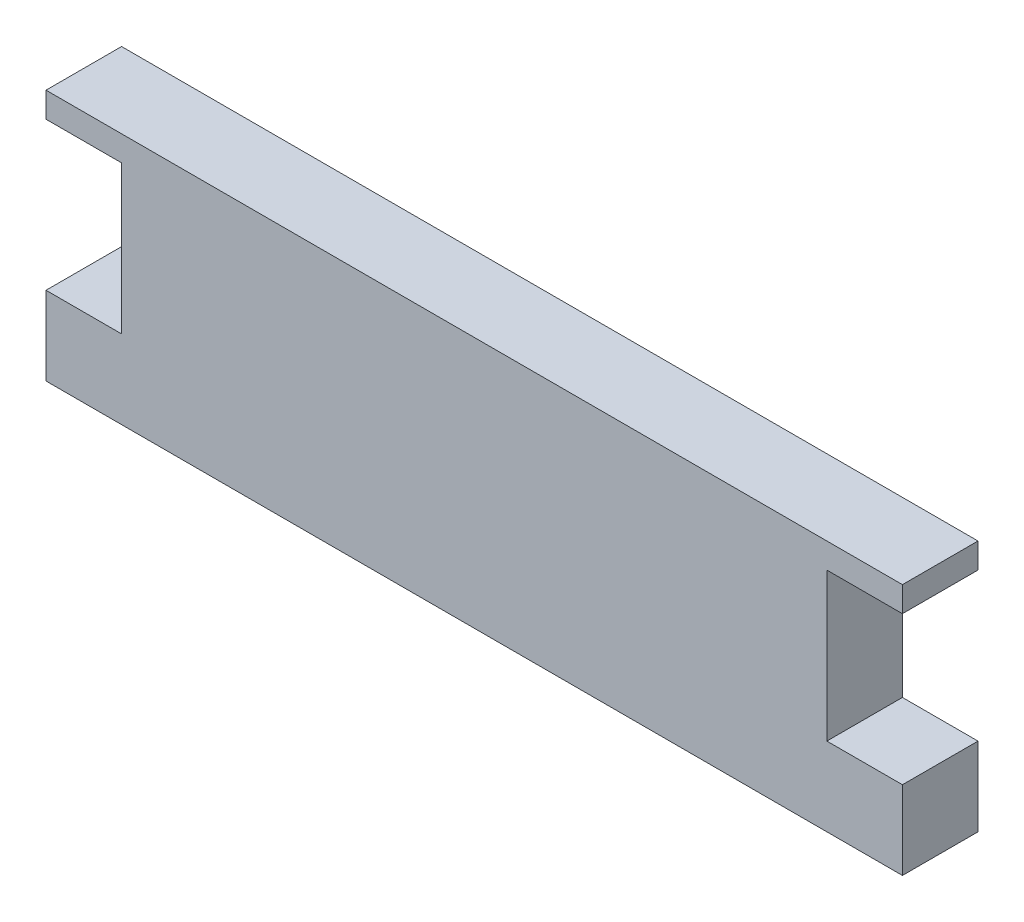
ISO-10303-21;
HEADER;
FILE_DESCRIPTION(('STEP AP214'),'2;1');
FILE_NAME('part.step','',(''),(''),'','','');
FILE_SCHEMA(('AUTOMOTIVE_DESIGN { 1 0 10303 214 1 1 1 1 }'));
ENDSEC;
DATA;
#1=APPLICATION_CONTEXT('core data for automotive mechanical design processes');
#2=APPLICATION_PROTOCOL_DEFINITION('international standard','automotive_design',2000,#1);
#3=PRODUCT_CONTEXT('',#1,'mechanical');
#4=PRODUCT('Part','Part','',(#3));
#5=PRODUCT_RELATED_PRODUCT_CATEGORY('part','',(#4));
#6=PRODUCT_DEFINITION_FORMATION('','',#4);
#7=PRODUCT_DEFINITION_CONTEXT('part definition',#1,'design');
#8=PRODUCT_DEFINITION('design','',#6,#7);
#9=PRODUCT_DEFINITION_SHAPE('','',#8);
#10=(LENGTH_UNIT() NAMED_UNIT(*) SI_UNIT(.MILLI.,.METRE.));
#11=(NAMED_UNIT(*) PLANE_ANGLE_UNIT() SI_UNIT($,.RADIAN.));
#12=(NAMED_UNIT(*) SI_UNIT($,.STERADIAN.) SOLID_ANGLE_UNIT());
#13=UNCERTAINTY_MEASURE_WITH_UNIT(LENGTH_MEASURE(1.E-05),#10,'distance_accuracy_value','');
#14=(GEOMETRIC_REPRESENTATION_CONTEXT(3) GLOBAL_UNCERTAINTY_ASSIGNED_CONTEXT((#13)) GLOBAL_UNIT_ASSIGNED_CONTEXT((#10,
#11,#12)) REPRESENTATION_CONTEXT('',''));
#15=CARTESIAN_POINT('',(0.,0.,0.));
#16=DIRECTION('',(0.,0.,1.));
#17=DIRECTION('',(1.,0.,0.));
#18=AXIS2_PLACEMENT_3D('',#15,#16,#17);
#19=CARTESIAN_POINT('',(-43.4426229508197,17.3155737704918,15.));
#20=DIRECTION('',(1.,0.,0.));
#21=DIRECTION('',(0.,1.,0.));
#22=AXIS2_PLACEMENT_3D('',#19,#20,#21);
#23=PLANE('',#22);
#24=DIRECTION('',(0.,-1.,0.));
#25=VECTOR('',#24,1.);
#26=CARTESIAN_POINT('',(-43.4426229508197,17.3155737704918,0.));
#27=LINE('',#26,#25);
#28=CARTESIAN_POINT('',(-43.4426229508197,17.3155737704918,0.));
#29=VERTEX_POINT('',#28);
#30=CARTESIAN_POINT('',(-43.4426229508197,12.3155446421243,0.));
#31=VERTEX_POINT('',#30);
#32=EDGE_CURVE('E155',#29,#31,#27,.T.);
#33=ORIENTED_EDGE('',*,*,#32,.T.);
#34=DIRECTION('',(0.,0.,-1.));
#35=VECTOR('',#34,1.);
#36=CARTESIAN_POINT('',(-43.4426229508197,12.3155446421243,15.));
#37=LINE('',#36,#35);
#38=CARTESIAN_POINT('',(-43.4426229508197,12.3155446421243,15.));
#39=VERTEX_POINT('',#38);
#40=EDGE_CURVE('E11',#39,#31,#37,.T.);
#41=ORIENTED_EDGE('',*,*,#40,.F.);
#42=DIRECTION('',(0.,-1.,0.));
#43=VECTOR('',#42,1.);
#44=CARTESIAN_POINT('',(-43.4426229508197,17.3155737704918,15.));
#45=LINE('',#44,#43);
#46=CARTESIAN_POINT('',(-43.4426229508197,17.3155737704918,15.));
#47=VERTEX_POINT('',#46);
#48=EDGE_CURVE('E177',#47,#39,#45,.T.);
#49=ORIENTED_EDGE('',*,*,#48,.F.);
#50=DIRECTION('',(0.,0.,-1.));
#51=VECTOR('',#50,1.);
#52=CARTESIAN_POINT('',(-43.4426229508197,17.3155737704918,15.));
#53=LINE('',#52,#51);
#54=EDGE_CURVE('E151',#47,#29,#53,.T.);
#55=ORIENTED_EDGE('',*,*,#54,.T.);
#56=EDGE_LOOP('',(#33,#41,#49,#55));
#57=FACE_BOUND('',#56,.T.);
#58=ADVANCED_FACE('F35',(#57),#23,.F.);
#59=CARTESIAN_POINT('',(-43.4426229508197,12.3155446421243,15.));
#60=DIRECTION('',(0.,1.,0.));
#61=DIRECTION('',(0.,0.,1.));
#62=AXIS2_PLACEMENT_3D('',#59,#60,#61);
#63=PLANE('',#62);
#64=DIRECTION('',(1.,0.,0.));
#65=VECTOR('',#64,1.);
#66=CARTESIAN_POINT('',(-43.4426229508197,12.3155446421243,0.));
#67=LINE('',#66,#65);
#68=CARTESIAN_POINT('',(-28.4426229508197,12.3155446421243,0.));
#69=VERTEX_POINT('',#68);
#70=EDGE_CURVE('E158',#31,#69,#67,.T.);
#71=ORIENTED_EDGE('',*,*,#70,.T.);
#72=DIRECTION('',(0.,0.,-1.));
#73=VECTOR('',#72,1.);
#74=CARTESIAN_POINT('',(-28.4426229508197,12.3155446421243,15.));
#75=LINE('',#74,#73);
#76=CARTESIAN_POINT('',(-28.4426229508197,12.3155446421243,15.));
#77=VERTEX_POINT('',#76);
#78=EDGE_CURVE('E43',#77,#69,#75,.T.);
#79=ORIENTED_EDGE('',*,*,#78,.F.);
#80=DIRECTION('',(1.,0.,0.));
#81=VECTOR('',#80,1.);
#82=CARTESIAN_POINT('',(-43.4426229508197,12.3155446421243,15.));
#83=LINE('',#82,#81);
#84=EDGE_CURVE('E106',#39,#77,#83,.T.);
#85=ORIENTED_EDGE('',*,*,#84,.F.);
#86=ORIENTED_EDGE('',*,*,#40,.T.);
#87=EDGE_LOOP('',(#71,#79,#85,#86));
#88=FACE_BOUND('',#87,.T.);
#89=ADVANCED_FACE('F255',(#88),#63,.F.);
#90=CARTESIAN_POINT('',(-28.4426229508197,12.3155446421243,15.));
#91=DIRECTION('',(1.,0.,0.));
#92=DIRECTION('',(0.,0.,-1.));
#93=AXIS2_PLACEMENT_3D('',#90,#91,#92);
#94=PLANE('',#93);
#95=DIRECTION('',(0.,-1.,0.));
#96=VECTOR('',#95,1.);
#97=CARTESIAN_POINT('',(-28.4426229508197,12.3155446421243,0.));
#98=LINE('',#97,#96);
#99=CARTESIAN_POINT('',(-28.4426229508197,-17.0825022316367,0.));
#100=VERTEX_POINT('',#99);
#101=EDGE_CURVE('E160',#69,#100,#98,.T.);
#102=ORIENTED_EDGE('',*,*,#101,.T.);
#103=DIRECTION('',(0.,0.,-1.));
#104=VECTOR('',#103,1.);
#105=CARTESIAN_POINT('',(-28.4426229508197,-17.0825022316367,15.));
#106=LINE('',#105,#104);
#107=CARTESIAN_POINT('',(-28.4426229508197,-17.0825022316367,15.));
#108=VERTEX_POINT('',#107);
#109=EDGE_CURVE('E196',#108,#100,#106,.T.);
#110=ORIENTED_EDGE('',*,*,#109,.F.);
#111=DIRECTION('',(0.,-1.,0.));
#112=VECTOR('',#111,1.);
#113=CARTESIAN_POINT('',(-28.4426229508197,12.3155446421243,15.));
#114=LINE('',#113,#112);
#115=EDGE_CURVE('E204',#77,#108,#114,.T.);
#116=ORIENTED_EDGE('',*,*,#115,.F.);
#117=ORIENTED_EDGE('',*,*,#78,.T.);
#118=EDGE_LOOP('',(#102,#110,#116,#117));
#119=FACE_BOUND('',#118,.T.);
#120=ADVANCED_FACE('F202',(#119),#94,.F.);
#121=CARTESIAN_POINT('',(-43.4426229508197,-17.0825022316367,15.));
#122=DIRECTION('',(0.,-1.,0.));
#123=DIRECTION('',(0.,0.,-1.));
#124=AXIS2_PLACEMENT_3D('',#121,#122,#123);
#125=PLANE('',#124);
#126=DIRECTION('',(-1.,0.,0.));
#127=VECTOR('',#126,1.);
#128=CARTESIAN_POINT('',(-43.4426229508197,-17.0825022316367,0.));
#129=LINE('',#128,#127);
#130=CARTESIAN_POINT('',(-43.4426229508197,-17.0825022316367,0.));
#131=VERTEX_POINT('',#130);
#132=EDGE_CURVE('E162',#100,#131,#129,.T.);
#133=ORIENTED_EDGE('',*,*,#132,.T.);
#134=DIRECTION('',(0.,0.,-1.));
#135=VECTOR('',#134,1.);
#136=CARTESIAN_POINT('',(-43.4426229508197,-17.0825022316367,15.));
#137=LINE('',#136,#135);
#138=CARTESIAN_POINT('',(-43.4426229508197,-17.0825022316367,15.));
#139=VERTEX_POINT('',#138);
#140=EDGE_CURVE('E193',#139,#131,#137,.T.);
#141=ORIENTED_EDGE('',*,*,#140,.F.);
#142=DIRECTION('',(-1.,0.,0.));
#143=VECTOR('',#142,1.);
#144=CARTESIAN_POINT('',(-43.4426229508197,-17.0825022316367,15.));
#145=LINE('',#144,#143);
#146=EDGE_CURVE('E222',#108,#139,#145,.T.);
#147=ORIENTED_EDGE('',*,*,#146,.F.);
#148=ORIENTED_EDGE('',*,*,#109,.T.);
#149=EDGE_LOOP('',(#133,#141,#147,#148));
#150=FACE_BOUND('',#149,.T.);
#151=ADVANCED_FACE('F213',(#150),#125,.F.);
#152=CARTESIAN_POINT('',(-43.4426229508197,-17.0825022316367,15.));
#153=DIRECTION('',(1.,0.,0.));
#154=DIRECTION('',(0.,1.,0.));
#155=AXIS2_PLACEMENT_3D('',#152,#153,#154);
#156=PLANE('',#155);
#157=DIRECTION('',(0.,-1.,0.));
#158=VECTOR('',#157,1.);
#159=CARTESIAN_POINT('',(-43.4426229508197,-17.0825022316367,0.));
#160=LINE('',#159,#158);
#161=CARTESIAN_POINT('',(-43.4426229508197,-32.6844262295082,0.));
#162=VERTEX_POINT('',#161);
#163=EDGE_CURVE('E164',#131,#162,#160,.T.);
#164=ORIENTED_EDGE('',*,*,#163,.T.);
#165=DIRECTION('',(0.,0.,-1.));
#166=VECTOR('',#165,1.);
#167=CARTESIAN_POINT('',(-43.4426229508197,-32.6844262295082,15.));
#168=LINE('',#167,#166);
#169=CARTESIAN_POINT('',(-43.4426229508197,-32.6844262295082,15.));
#170=VERTEX_POINT('',#169);
#171=EDGE_CURVE('E190',#170,#162,#168,.T.);
#172=ORIENTED_EDGE('',*,*,#171,.F.);
#173=DIRECTION('',(0.,-1.,0.));
#174=VECTOR('',#173,1.);
#175=CARTESIAN_POINT('',(-43.4426229508197,-17.0825022316367,15.));
#176=LINE('',#175,#174);
#177=EDGE_CURVE('E219',#139,#170,#176,.T.);
#178=ORIENTED_EDGE('',*,*,#177,.F.);
#179=ORIENTED_EDGE('',*,*,#140,.T.);
#180=EDGE_LOOP('',(#164,#172,#178,#179));
#181=FACE_BOUND('',#180,.T.);
#182=ADVANCED_FACE('F217',(#181),#156,.F.);
#183=CARTESIAN_POINT('',(-43.4426229508197,-32.6844262295082,15.));
#184=DIRECTION('',(0.,1.,0.));
#185=DIRECTION('',(-1.,0.,0.));
#186=AXIS2_PLACEMENT_3D('',#183,#184,#185);
#187=PLANE('',#186);
#188=DIRECTION('',(1.,0.,0.));
#189=VECTOR('',#188,1.);
#190=CARTESIAN_POINT('',(-43.4426229508197,-32.6844262295082,0.));
#191=LINE('',#190,#189);
#192=CARTESIAN_POINT('',(126.55737704918,-32.6844262295082,0.));
#193=VERTEX_POINT('',#192);
#194=EDGE_CURVE('E166',#162,#193,#191,.T.);
#195=ORIENTED_EDGE('',*,*,#194,.T.);
#196=DIRECTION('',(0.,0.,-1.));
#197=VECTOR('',#196,1.);
#198=CARTESIAN_POINT('',(126.55737704918,-32.6844262295082,15.));
#199=LINE('',#198,#197);
#200=CARTESIAN_POINT('',(126.55737704918,-32.6844262295082,15.));
#201=VERTEX_POINT('',#200);
#202=EDGE_CURVE('E187',#201,#193,#199,.T.);
#203=ORIENTED_EDGE('',*,*,#202,.F.);
#204=DIRECTION('',(1.,0.,0.));
#205=VECTOR('',#204,1.);
#206=CARTESIAN_POINT('',(-43.4426229508197,-32.6844262295082,15.));
#207=LINE('',#206,#205);
#208=EDGE_CURVE('E221',#170,#201,#207,.T.);
#209=ORIENTED_EDGE('',*,*,#208,.F.);
#210=ORIENTED_EDGE('',*,*,#171,.T.);
#211=EDGE_LOOP('',(#195,#203,#209,#210));
#212=FACE_BOUND('',#211,.T.);
#213=ADVANCED_FACE('F268',(#212),#187,.F.);
#214=CARTESIAN_POINT('',(126.55737704918,-17.0825022316367,15.));
#215=DIRECTION('',(-1.,0.,0.));
#216=DIRECTION('',(0.,0.,1.));
#217=AXIS2_PLACEMENT_3D('',#214,#215,#216);
#218=PLANE('',#217);
#219=DIRECTION('',(0.,1.,0.));
#220=VECTOR('',#219,1.);
#221=CARTESIAN_POINT('',(126.55737704918,-17.0825022316367,0.));
#222=LINE('',#221,#220);
#223=CARTESIAN_POINT('',(126.55737704918,-17.0825022316367,0.));
#224=VERTEX_POINT('',#223);
#225=EDGE_CURVE('E168',#193,#224,#222,.T.);
#226=ORIENTED_EDGE('',*,*,#225,.T.);
#227=DIRECTION('',(0.,0.,-1.));
#228=VECTOR('',#227,1.);
#229=CARTESIAN_POINT('',(126.55737704918,-17.0825022316367,15.));
#230=LINE('',#229,#228);
#231=CARTESIAN_POINT('',(126.55737704918,-17.0825022316367,15.));
#232=VERTEX_POINT('',#231);
#233=EDGE_CURVE('E184',#232,#224,#230,.T.);
#234=ORIENTED_EDGE('',*,*,#233,.F.);
#235=DIRECTION('',(0.,1.,0.));
#236=VECTOR('',#235,1.);
#237=CARTESIAN_POINT('',(126.55737704918,-17.0825022316367,15.));
#238=LINE('',#237,#236);
#239=EDGE_CURVE('E224',#201,#232,#238,.T.);
#240=ORIENTED_EDGE('',*,*,#239,.F.);
#241=ORIENTED_EDGE('',*,*,#202,.T.);
#242=EDGE_LOOP('',(#226,#234,#240,#241));
#243=FACE_BOUND('',#242,.T.);
#244=ADVANCED_FACE('F271',(#243),#218,.F.);
#245=CARTESIAN_POINT('',(126.55737704918,-17.0825022316367,15.));
#246=DIRECTION('',(0.,-1.,0.));
#247=DIRECTION('',(0.,0.,-1.));
#248=AXIS2_PLACEMENT_3D('',#245,#246,#247);
#249=PLANE('',#248);
#250=DIRECTION('',(-1.,0.,0.));
#251=VECTOR('',#250,1.);
#252=CARTESIAN_POINT('',(126.55737704918,-17.0825022316367,0.));
#253=LINE('',#252,#251);
#254=CARTESIAN_POINT('',(111.55737704918,-17.0825022316367,0.));
#255=VERTEX_POINT('',#254);
#256=EDGE_CURVE('E170',#224,#255,#253,.T.);
#257=ORIENTED_EDGE('',*,*,#256,.T.);
#258=DIRECTION('',(0.,0.,-1.));
#259=VECTOR('',#258,1.);
#260=CARTESIAN_POINT('',(111.55737704918,-17.0825022316367,15.));
#261=LINE('',#260,#259);
#262=CARTESIAN_POINT('',(111.55737704918,-17.0825022316367,15.));
#263=VERTEX_POINT('',#262);
#264=EDGE_CURVE('E181',#263,#255,#261,.T.);
#265=ORIENTED_EDGE('',*,*,#264,.F.);
#266=DIRECTION('',(-1.,0.,0.));
#267=VECTOR('',#266,1.);
#268=CARTESIAN_POINT('',(126.55737704918,-17.0825022316367,15.));
#269=LINE('',#268,#267);
#270=EDGE_CURVE('E230',#232,#263,#269,.T.);
#271=ORIENTED_EDGE('',*,*,#270,.F.);
#272=ORIENTED_EDGE('',*,*,#233,.T.);
#273=EDGE_LOOP('',(#257,#265,#271,#272));
#274=FACE_BOUND('',#273,.T.);
#275=ADVANCED_FACE('F236',(#274),#249,.F.);
#276=CARTESIAN_POINT('',(111.55737704918,12.3155446421243,15.));
#277=DIRECTION('',(-1.,0.,0.));
#278=DIRECTION('',(0.,0.,1.));
#279=AXIS2_PLACEMENT_3D('',#276,#277,#278);
#280=PLANE('',#279);
#281=DIRECTION('',(0.,1.,0.));
#282=VECTOR('',#281,1.);
#283=CARTESIAN_POINT('',(111.55737704918,12.3155446421243,0.));
#284=LINE('',#283,#282);
#285=CARTESIAN_POINT('',(111.55737704918,12.3155446421243,0.));
#286=VERTEX_POINT('',#285);
#287=EDGE_CURVE('E172',#255,#286,#284,.T.);
#288=ORIENTED_EDGE('',*,*,#287,.T.);
#289=DIRECTION('',(0.,0.,-1.));
#290=VECTOR('',#289,1.);
#291=CARTESIAN_POINT('',(111.55737704918,12.3155446421243,15.));
#292=LINE('',#291,#290);
#293=CARTESIAN_POINT('',(111.55737704918,12.3155446421243,15.));
#294=VERTEX_POINT('',#293);
#295=EDGE_CURVE('E146',#294,#286,#292,.T.);
#296=ORIENTED_EDGE('',*,*,#295,.F.);
#297=DIRECTION('',(0.,1.,0.));
#298=VECTOR('',#297,1.);
#299=CARTESIAN_POINT('',(111.55737704918,12.3155446421243,15.));
#300=LINE('',#299,#298);
#301=EDGE_CURVE('E137',#263,#294,#300,.T.);
#302=ORIENTED_EDGE('',*,*,#301,.F.);
#303=ORIENTED_EDGE('',*,*,#264,.T.);
#304=EDGE_LOOP('',(#288,#296,#302,#303));
#305=FACE_BOUND('',#304,.T.);
#306=ADVANCED_FACE('F240',(#305),#280,.F.);
#307=CARTESIAN_POINT('',(126.55737704918,12.3155446421243,15.));
#308=DIRECTION('',(0.,1.,0.));
#309=DIRECTION('',(-1.,0.,0.));
#310=AXIS2_PLACEMENT_3D('',#307,#308,#309);
#311=PLANE('',#310);
#312=DIRECTION('',(1.,0.,0.));
#313=VECTOR('',#312,1.);
#314=CARTESIAN_POINT('',(126.55737704918,12.3155446421243,0.));
#315=LINE('',#314,#313);
#316=CARTESIAN_POINT('',(126.55737704918,12.3155446421243,0.));
#317=VERTEX_POINT('',#316);
#318=EDGE_CURVE('E145',#286,#317,#315,.T.);
#319=ORIENTED_EDGE('',*,*,#318,.T.);
#320=DIRECTION('',(0.,0.,-1.));
#321=VECTOR('',#320,1.);
#322=CARTESIAN_POINT('',(126.55737704918,12.3155446421243,15.));
#323=LINE('',#322,#321);
#324=CARTESIAN_POINT('',(126.55737704918,12.3155446421243,15.));
#325=VERTEX_POINT('',#324);
#326=EDGE_CURVE('E142',#325,#317,#323,.T.);
#327=ORIENTED_EDGE('',*,*,#326,.F.);
#328=DIRECTION('',(1.,0.,0.));
#329=VECTOR('',#328,1.);
#330=CARTESIAN_POINT('',(126.55737704918,12.3155446421243,15.));
#331=LINE('',#330,#329);
#332=EDGE_CURVE('E131',#294,#325,#331,.T.);
#333=ORIENTED_EDGE('',*,*,#332,.F.);
#334=ORIENTED_EDGE('',*,*,#295,.T.);
#335=EDGE_LOOP('',(#319,#327,#333,#334));
#336=FACE_BOUND('',#335,.T.);
#337=ADVANCED_FACE('F143',(#336),#311,.F.);
#338=CARTESIAN_POINT('',(126.55737704918,17.3155737704918,15.));
#339=DIRECTION('',(-1.,0.,0.));
#340=DIRECTION('',(0.,0.,1.));
#341=AXIS2_PLACEMENT_3D('',#338,#339,#340);
#342=PLANE('',#341);
#343=DIRECTION('',(0.,1.,0.));
#344=VECTOR('',#343,1.);
#345=CARTESIAN_POINT('',(126.55737704918,17.3155737704918,0.));
#346=LINE('',#345,#344);
#347=CARTESIAN_POINT('',(126.55737704918,17.3155737704918,0.));
#348=VERTEX_POINT('',#347);
#349=EDGE_CURVE('E92',#317,#348,#346,.T.);
#350=ORIENTED_EDGE('',*,*,#349,.T.);
#351=DIRECTION('',(0.,0.,-1.));
#352=VECTOR('',#351,1.);
#353=CARTESIAN_POINT('',(126.55737704918,17.3155737704918,15.));
#354=LINE('',#353,#352);
#355=CARTESIAN_POINT('',(126.55737704918,17.3155737704918,15.));
#356=VERTEX_POINT('',#355);
#357=EDGE_CURVE('E147',#356,#348,#354,.T.);
#358=ORIENTED_EDGE('',*,*,#357,.F.);
#359=DIRECTION('',(0.,1.,0.));
#360=VECTOR('',#359,1.);
#361=CARTESIAN_POINT('',(126.55737704918,17.3155737704918,15.));
#362=LINE('',#361,#360);
#363=EDGE_CURVE('E135',#325,#356,#362,.T.);
#364=ORIENTED_EDGE('',*,*,#363,.F.);
#365=ORIENTED_EDGE('',*,*,#326,.T.);
#366=EDGE_LOOP('',(#350,#358,#364,#365));
#367=FACE_BOUND('',#366,.T.);
#368=ADVANCED_FACE('F149',(#367),#342,.F.);
#369=CARTESIAN_POINT('',(-43.4426229508197,17.3155737704918,15.));
#370=DIRECTION('',(0.,-1.,0.));
#371=DIRECTION('',(0.,0.,-1.));
#372=AXIS2_PLACEMENT_3D('',#369,#370,#371);
#373=PLANE('',#372);
#374=DIRECTION('',(-1.,0.,0.));
#375=VECTOR('',#374,1.);
#376=CARTESIAN_POINT('',(-43.4426229508197,17.3155737704918,0.));
#377=LINE('',#376,#375);
#378=EDGE_CURVE('E98',#348,#29,#377,.T.);
#379=ORIENTED_EDGE('',*,*,#378,.T.);
#380=ORIENTED_EDGE('',*,*,#54,.F.);
#381=DIRECTION('',(-1.,0.,0.));
#382=VECTOR('',#381,1.);
#383=CARTESIAN_POINT('',(-43.4426229508197,17.3155737704918,15.));
#384=LINE('',#383,#382);
#385=EDGE_CURVE('E51',#356,#47,#384,.T.);
#386=ORIENTED_EDGE('',*,*,#385,.F.);
#387=ORIENTED_EDGE('',*,*,#357,.T.);
#388=EDGE_LOOP('',(#379,#380,#386,#387));
#389=FACE_BOUND('',#388,.T.);
#390=ADVANCED_FACE('F244',(#389),#373,.F.);
#391=CARTESIAN_POINT('',(0.,0.,15.));
#392=DIRECTION('',(0.,0.,1.));
#393=DIRECTION('',(1.,0.,0.));
#394=AXIS2_PLACEMENT_3D('',#391,#392,#393);
#395=PLANE('',#394);
#396=ORIENTED_EDGE('',*,*,#48,.T.);
#397=ORIENTED_EDGE('',*,*,#84,.T.);
#398=ORIENTED_EDGE('',*,*,#115,.T.);
#399=ORIENTED_EDGE('',*,*,#146,.T.);
#400=ORIENTED_EDGE('',*,*,#177,.T.);
#401=ORIENTED_EDGE('',*,*,#208,.T.);
#402=ORIENTED_EDGE('',*,*,#239,.T.);
#403=ORIENTED_EDGE('',*,*,#270,.T.);
#404=ORIENTED_EDGE('',*,*,#301,.T.);
#405=ORIENTED_EDGE('',*,*,#332,.T.);
#406=ORIENTED_EDGE('',*,*,#363,.T.);
#407=ORIENTED_EDGE('',*,*,#385,.T.);
#408=EDGE_LOOP('',(#396,#397,#398,#399,#400,#401,#402,#403,#404,#405,#406,#407));
#409=FACE_BOUND('',#408,.T.);
#410=ADVANCED_FACE('F133',(#409),#395,.T.);
#411=CARTESIAN_POINT('',(0.,0.,0.));
#412=DIRECTION('',(0.,0.,1.));
#413=DIRECTION('',(1.,0.,0.));
#414=AXIS2_PLACEMENT_3D('',#411,#412,#413);
#415=PLANE('',#414);
#416=ORIENTED_EDGE('',*,*,#32,.F.);
#417=ORIENTED_EDGE('',*,*,#378,.F.);
#418=ORIENTED_EDGE('',*,*,#349,.F.);
#419=ORIENTED_EDGE('',*,*,#318,.F.);
#420=ORIENTED_EDGE('',*,*,#287,.F.);
#421=ORIENTED_EDGE('',*,*,#256,.F.);
#422=ORIENTED_EDGE('',*,*,#225,.F.);
#423=ORIENTED_EDGE('',*,*,#194,.F.);
#424=ORIENTED_EDGE('',*,*,#163,.F.);
#425=ORIENTED_EDGE('',*,*,#132,.F.);
#426=ORIENTED_EDGE('',*,*,#101,.F.);
#427=ORIENTED_EDGE('',*,*,#70,.F.);
#428=EDGE_LOOP('',(#416,#417,#418,#419,#420,#421,#422,#423,#424,#425,#426,#427));
#429=FACE_BOUND('',#428,.T.);
#430=ADVANCED_FACE('F208',(#429),#415,.F.);
#431=CLOSED_SHELL('',(#58,#89,#120,#151,#182,#213,#244,#275,#306,#337,#368,#390,#410,#430));
#432=MANIFOLD_SOLID_BREP('B2',#431);
#433=ADVANCED_BREP_SHAPE_REPRESENTATION('',(#18,#432),#14);
#434=SHAPE_DEFINITION_REPRESENTATION(#9,#433);
ENDSEC;
END-ISO-10303-21;
